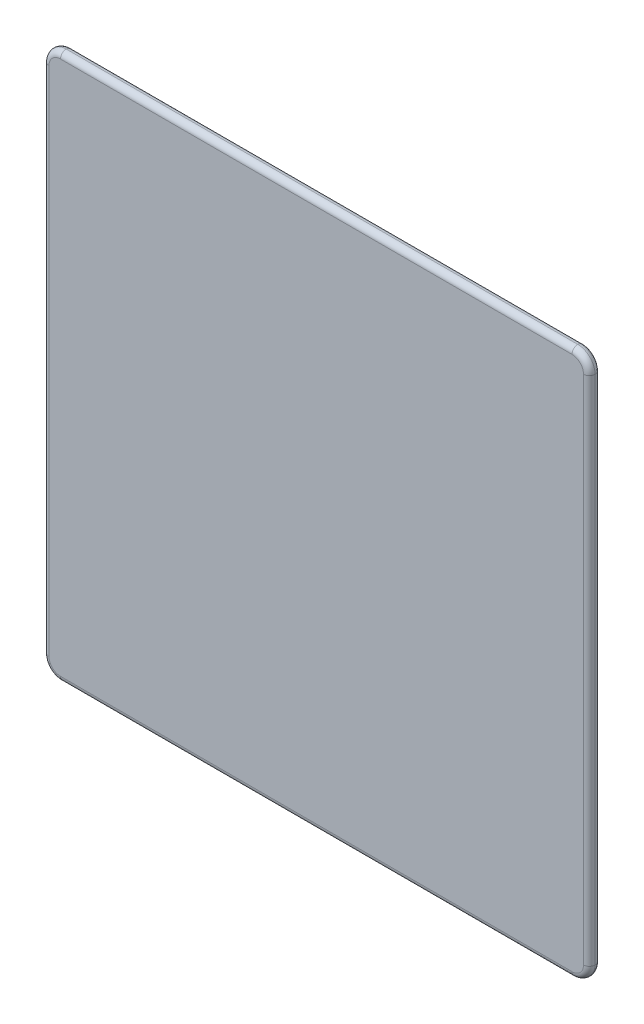
ISO-10303-21;
HEADER;
FILE_DESCRIPTION(('STEP AP214'),'2;1');
FILE_NAME('part.step','',(''),(''),'','','');
FILE_SCHEMA(('AUTOMOTIVE_DESIGN { 1 0 10303 214 1 1 1 1 }'));
ENDSEC;
DATA;
#1=APPLICATION_CONTEXT('core data for automotive mechanical design processes');
#2=APPLICATION_PROTOCOL_DEFINITION('international standard','automotive_design',2000,#1);
#3=PRODUCT_CONTEXT('',#1,'mechanical');
#4=PRODUCT('Part','Part','',(#3));
#5=PRODUCT_RELATED_PRODUCT_CATEGORY('part','',(#4));
#6=PRODUCT_DEFINITION_FORMATION('','',#4);
#7=PRODUCT_DEFINITION_CONTEXT('part definition',#1,'design');
#8=PRODUCT_DEFINITION('design','',#6,#7);
#9=PRODUCT_DEFINITION_SHAPE('','',#8);
#10=(LENGTH_UNIT() NAMED_UNIT(*) SI_UNIT(.MILLI.,.METRE.));
#11=(NAMED_UNIT(*) PLANE_ANGLE_UNIT() SI_UNIT($,.RADIAN.));
#12=(NAMED_UNIT(*) SI_UNIT($,.STERADIAN.) SOLID_ANGLE_UNIT());
#13=UNCERTAINTY_MEASURE_WITH_UNIT(LENGTH_MEASURE(1.E-05),#10,'distance_accuracy_value','');
#14=(GEOMETRIC_REPRESENTATION_CONTEXT(3) GLOBAL_UNCERTAINTY_ASSIGNED_CONTEXT((#13)) GLOBAL_UNIT_ASSIGNED_CONTEXT((#10,
#11,#12)) REPRESENTATION_CONTEXT('',''));
#15=CARTESIAN_POINT('',(0.,0.,0.));
#16=DIRECTION('',(0.,0.,1.));
#17=DIRECTION('',(1.,0.,0.));
#18=AXIS2_PLACEMENT_3D('',#15,#16,#17);
#19=CARTESIAN_POINT('',(0.,0.,2.));
#20=DIRECTION('',(0.,0.,1.));
#21=DIRECTION('',(1.,0.,0.));
#22=AXIS2_PLACEMENT_3D('',#19,#20,#21);
#23=PLANE('',#22);
#24=DIRECTION('',(0.,1.,0.));
#25=VECTOR('',#24,1.);
#26=CARTESIAN_POINT('',(46.4,44.4,2.));
#27=LINE('',#26,#25);
#28=CARTESIAN_POINT('',(46.4,-44.4,2.));
#29=VERTEX_POINT('',#28);
#30=CARTESIAN_POINT('',(46.4,44.4,2.));
#31=VERTEX_POINT('',#30);
#32=EDGE_CURVE('E49',#29,#31,#27,.T.);
#33=ORIENTED_EDGE('',*,*,#32,.T.);
#34=CARTESIAN_POINT('',(44.4,44.4,2.));
#35=DIRECTION('',(0.,0.,1.));
#36=DIRECTION('',(1.,0.,0.));
#37=AXIS2_PLACEMENT_3D('',#34,#35,#36);
#38=CIRCLE('',#37,2.);
#39=CARTESIAN_POINT('',(44.4,46.4,2.));
#40=VERTEX_POINT('',#39);
#41=EDGE_CURVE('E11',#31,#40,#38,.T.);
#42=ORIENTED_EDGE('',*,*,#41,.T.);
#43=DIRECTION('',(-1.,0.,0.));
#44=VECTOR('',#43,1.);
#45=CARTESIAN_POINT('',(-44.4,46.4,2.));
#46=LINE('',#45,#44);
#47=CARTESIAN_POINT('',(-44.4,46.4,2.));
#48=VERTEX_POINT('',#47);
#49=EDGE_CURVE('E240',#40,#48,#46,.T.);
#50=ORIENTED_EDGE('',*,*,#49,.T.);
#51=CARTESIAN_POINT('',(-44.4,44.4,2.));
#52=DIRECTION('',(0.,0.,1.));
#53=DIRECTION('',(1.,0.,0.));
#54=AXIS2_PLACEMENT_3D('',#51,#52,#53);
#55=CIRCLE('',#54,2.);
#56=CARTESIAN_POINT('',(-46.4,44.4,2.));
#57=VERTEX_POINT('',#56);
#58=EDGE_CURVE('E237',#48,#57,#55,.T.);
#59=ORIENTED_EDGE('',*,*,#58,.T.);
#60=DIRECTION('',(0.,-1.,0.));
#61=VECTOR('',#60,1.);
#62=CARTESIAN_POINT('',(-46.4,-44.4,2.));
#63=LINE('',#62,#61);
#64=CARTESIAN_POINT('',(-46.4,-44.4,2.));
#65=VERTEX_POINT('',#64);
#66=EDGE_CURVE('E241',#57,#65,#63,.T.);
#67=ORIENTED_EDGE('',*,*,#66,.T.);
#68=CARTESIAN_POINT('',(-44.4,-44.4,2.));
#69=DIRECTION('',(0.,0.,1.));
#70=DIRECTION('',(1.,0.,0.));
#71=AXIS2_PLACEMENT_3D('',#68,#69,#70);
#72=CIRCLE('',#71,2.);
#73=CARTESIAN_POINT('',(-44.4,-46.4,2.));
#74=VERTEX_POINT('',#73);
#75=EDGE_CURVE('E139',#65,#74,#72,.T.);
#76=ORIENTED_EDGE('',*,*,#75,.T.);
#77=DIRECTION('',(1.,0.,0.));
#78=VECTOR('',#77,1.);
#79=CARTESIAN_POINT('',(44.4,-46.4,2.));
#80=LINE('',#79,#78);
#81=CARTESIAN_POINT('',(44.4,-46.4,2.));
#82=VERTEX_POINT('',#81);
#83=EDGE_CURVE('E133',#74,#82,#80,.T.);
#84=ORIENTED_EDGE('',*,*,#83,.T.);
#85=CARTESIAN_POINT('',(44.4,-44.4,2.));
#86=DIRECTION('',(0.,0.,1.));
#87=DIRECTION('',(1.,0.,0.));
#88=AXIS2_PLACEMENT_3D('',#85,#86,#87);
#89=CIRCLE('',#88,2.);
#90=EDGE_CURVE('E136',#82,#29,#89,.T.);
#91=ORIENTED_EDGE('',*,*,#90,.T.);
#92=EDGE_LOOP('',(#33,#42,#50,#59,#67,#76,#84,#91));
#93=FACE_BOUND('',#92,.T.);
#94=ADVANCED_FACE('F37',(#93),#23,.T.);
#95=CARTESIAN_POINT('',(0.,0.,0.));
#96=DIRECTION('',(0.,0.,1.));
#97=DIRECTION('',(1.,0.,0.));
#98=AXIS2_PLACEMENT_3D('',#95,#96,#97);
#99=PLANE('',#98);
#100=DIRECTION('',(-1.,0.,0.));
#101=VECTOR('',#100,1.);
#102=CARTESIAN_POINT('',(0.,46.4,0.));
#103=LINE('',#102,#101);
#104=CARTESIAN_POINT('',(-44.4,46.4,0.));
#105=VERTEX_POINT('',#104);
#106=CARTESIAN_POINT('',(44.4,46.4,0.));
#107=VERTEX_POINT('',#106);
#108=EDGE_CURVE('E217',#105,#107,#103,.F.);
#109=ORIENTED_EDGE('',*,*,#108,.T.);
#110=CARTESIAN_POINT('',(44.4,44.4,0.));
#111=DIRECTION('',(0.,0.,1.));
#112=DIRECTION('',(1.,0.,0.));
#113=AXIS2_PLACEMENT_3D('',#110,#111,#112);
#114=CIRCLE('',#113,2.);
#115=CARTESIAN_POINT('',(46.4,44.4,0.));
#116=VERTEX_POINT('',#115);
#117=EDGE_CURVE('E232',#107,#116,#114,.F.);
#118=ORIENTED_EDGE('',*,*,#117,.T.);
#119=DIRECTION('',(0.,1.,0.));
#120=VECTOR('',#119,1.);
#121=CARTESIAN_POINT('',(46.4,0.,0.));
#122=LINE('',#121,#120);
#123=CARTESIAN_POINT('',(46.4,-44.4,0.));
#124=VERTEX_POINT('',#123);
#125=EDGE_CURVE('E231',#116,#124,#122,.F.);
#126=ORIENTED_EDGE('',*,*,#125,.T.);
#127=CARTESIAN_POINT('',(44.4,-44.4,0.));
#128=DIRECTION('',(0.,0.,1.));
#129=DIRECTION('',(1.,0.,0.));
#130=AXIS2_PLACEMENT_3D('',#127,#128,#129);
#131=CIRCLE('',#130,2.);
#132=CARTESIAN_POINT('',(44.4,-46.4,0.));
#133=VERTEX_POINT('',#132);
#134=EDGE_CURVE('E233',#124,#133,#131,.F.);
#135=ORIENTED_EDGE('',*,*,#134,.T.);
#136=DIRECTION('',(1.,0.,0.));
#137=VECTOR('',#136,1.);
#138=CARTESIAN_POINT('',(0.,-46.4,0.));
#139=LINE('',#138,#137);
#140=CARTESIAN_POINT('',(-44.4,-46.4,0.));
#141=VERTEX_POINT('',#140);
#142=EDGE_CURVE('E230',#133,#141,#139,.F.);
#143=ORIENTED_EDGE('',*,*,#142,.T.);
#144=CARTESIAN_POINT('',(-44.4,-44.4,0.));
#145=DIRECTION('',(0.,0.,1.));
#146=DIRECTION('',(1.,0.,0.));
#147=AXIS2_PLACEMENT_3D('',#144,#145,#146);
#148=CIRCLE('',#147,2.);
#149=CARTESIAN_POINT('',(-46.4,-44.4,0.));
#150=VERTEX_POINT('',#149);
#151=EDGE_CURVE('E227',#141,#150,#148,.F.);
#152=ORIENTED_EDGE('',*,*,#151,.T.);
#153=DIRECTION('',(0.,-1.,0.));
#154=VECTOR('',#153,1.);
#155=CARTESIAN_POINT('',(-46.4,0.,0.));
#156=LINE('',#155,#154);
#157=CARTESIAN_POINT('',(-46.4,44.4,0.));
#158=VERTEX_POINT('',#157);
#159=EDGE_CURVE('E221',#150,#158,#156,.F.);
#160=ORIENTED_EDGE('',*,*,#159,.T.);
#161=CARTESIAN_POINT('',(-44.4,44.4,0.));
#162=DIRECTION('',(0.,0.,1.));
#163=DIRECTION('',(1.,0.,0.));
#164=AXIS2_PLACEMENT_3D('',#161,#162,#163);
#165=CIRCLE('',#164,2.);
#166=EDGE_CURVE('E96',#158,#105,#165,.F.);
#167=ORIENTED_EDGE('',*,*,#166,.T.);
#168=EDGE_LOOP('',(#109,#118,#126,#135,#143,#152,#160,#167));
#169=FACE_BOUND('',#168,.T.);
#170=ADVANCED_FACE('F282',(#169),#99,.F.);
#171=CARTESIAN_POINT('',(-44.4,-44.4,1.));
#172=DIRECTION('',(0.,0.,1.));
#173=DIRECTION('',(1.,0.,0.));
#174=AXIS2_PLACEMENT_3D('',#171,#172,#173);
#175=TOROIDAL_SURFACE('',#174,2.,1.);
#176=CARTESIAN_POINT('',(-44.4,-46.4,1.));
#177=DIRECTION('',(1.,0.,0.));
#178=DIRECTION('',(0.,0.,-1.));
#179=AXIS2_PLACEMENT_3D('',#176,#177,#178);
#180=CIRCLE('',#179,1.);
#181=CARTESIAN_POINT('',(-44.4,-47.4,1.));
#182=VERTEX_POINT('',#181);
#183=EDGE_CURVE('E212',#74,#182,#180,.T.);
#184=ORIENTED_EDGE('',*,*,#183,.F.);
#185=ORIENTED_EDGE('',*,*,#75,.F.);
#186=CARTESIAN_POINT('',(-46.4,-44.4,1.));
#187=DIRECTION('',(0.,1.,0.));
#188=DIRECTION('',(0.,0.,1.));
#189=AXIS2_PLACEMENT_3D('',#186,#187,#188);
#190=CIRCLE('',#189,1.);
#191=CARTESIAN_POINT('',(-47.4,-44.4,1.));
#192=VERTEX_POINT('',#191);
#193=EDGE_CURVE('E42',#192,#65,#190,.T.);
#194=ORIENTED_EDGE('',*,*,#193,.F.);
#195=CARTESIAN_POINT('',(-44.4,-44.4,1.));
#196=DIRECTION('',(0.,0.,1.));
#197=DIRECTION('',(1.,0.,0.));
#198=AXIS2_PLACEMENT_3D('',#195,#196,#197);
#199=CIRCLE('',#198,3.);
#200=EDGE_CURVE('E87',#182,#192,#199,.F.);
#201=ORIENTED_EDGE('',*,*,#200,.F.);
#202=EDGE_LOOP('',(#184,#185,#194,#201));
#203=FACE_BOUND('',#202,.T.);
#204=ADVANCED_FACE('F45',(#203),#175,.T.);
#205=CARTESIAN_POINT('',(-46.4,0.,1.));
#206=DIRECTION('',(0.,1.,0.));
#207=DIRECTION('',(-1.,0.,0.));
#208=AXIS2_PLACEMENT_3D('',#205,#206,#207);
#209=CYLINDRICAL_SURFACE('',#208,1.);
#210=ORIENTED_EDGE('',*,*,#193,.T.);
#211=ORIENTED_EDGE('',*,*,#66,.F.);
#212=CARTESIAN_POINT('',(-46.4,44.4,1.));
#213=DIRECTION('',(0.,1.,0.));
#214=DIRECTION('',(0.,0.,1.));
#215=AXIS2_PLACEMENT_3D('',#212,#213,#214);
#216=CIRCLE('',#215,1.);
#217=CARTESIAN_POINT('',(-47.4,44.4,1.));
#218=VERTEX_POINT('',#217);
#219=EDGE_CURVE('E206',#218,#57,#216,.T.);
#220=ORIENTED_EDGE('',*,*,#219,.F.);
#221=DIRECTION('',(0.,-1.,0.));
#222=VECTOR('',#221,1.);
#223=CARTESIAN_POINT('',(-47.4,44.4,1.));
#224=LINE('',#223,#222);
#225=EDGE_CURVE('E204',#192,#218,#224,.F.);
#226=ORIENTED_EDGE('',*,*,#225,.F.);
#227=EDGE_LOOP('',(#210,#211,#220,#226));
#228=FACE_BOUND('',#227,.T.);
#229=ADVANCED_FACE('F274',(#228),#209,.T.);
#230=CARTESIAN_POINT('',(-44.4,-44.4,1.));
#231=DIRECTION('',(0.,0.,1.));
#232=DIRECTION('',(1.,0.,0.));
#233=AXIS2_PLACEMENT_3D('',#230,#231,#232);
#234=TOROIDAL_SURFACE('',#233,2.,1.);
#235=CARTESIAN_POINT('',(-44.4,-46.4,1.));
#236=DIRECTION('',(1.,0.,0.));
#237=DIRECTION('',(0.,0.,-1.));
#238=AXIS2_PLACEMENT_3D('',#235,#236,#237);
#239=CIRCLE('',#238,1.);
#240=EDGE_CURVE('E196',#182,#141,#239,.T.);
#241=ORIENTED_EDGE('',*,*,#240,.F.);
#242=ORIENTED_EDGE('',*,*,#200,.T.);
#243=CARTESIAN_POINT('',(-46.4,-44.4,1.));
#244=DIRECTION('',(0.,1.,0.));
#245=DIRECTION('',(0.,0.,1.));
#246=AXIS2_PLACEMENT_3D('',#243,#244,#245);
#247=CIRCLE('',#246,1.);
#248=EDGE_CURVE('E205',#150,#192,#247,.T.);
#249=ORIENTED_EDGE('',*,*,#248,.F.);
#250=ORIENTED_EDGE('',*,*,#151,.F.);
#251=EDGE_LOOP('',(#241,#242,#249,#250));
#252=FACE_BOUND('',#251,.T.);
#253=ADVANCED_FACE('F242',(#252),#234,.T.);
#254=CARTESIAN_POINT('',(0.,-46.4,1.));
#255=DIRECTION('',(-1.,0.,0.));
#256=DIRECTION('',(0.,0.,1.));
#257=AXIS2_PLACEMENT_3D('',#254,#255,#256);
#258=CYLINDRICAL_SURFACE('',#257,1.);
#259=ORIENTED_EDGE('',*,*,#83,.F.);
#260=ORIENTED_EDGE('',*,*,#183,.T.);
#261=DIRECTION('',(1.,0.,0.));
#262=VECTOR('',#261,1.);
#263=CARTESIAN_POINT('',(-44.4,-47.4,1.));
#264=LINE('',#263,#262);
#265=CARTESIAN_POINT('',(44.4,-47.4,1.));
#266=VERTEX_POINT('',#265);
#267=EDGE_CURVE('E150',#266,#182,#264,.F.);
#268=ORIENTED_EDGE('',*,*,#267,.F.);
#269=CARTESIAN_POINT('',(44.4,-46.4,1.));
#270=DIRECTION('',(1.,0.,0.));
#271=DIRECTION('',(0.,0.,-1.));
#272=AXIS2_PLACEMENT_3D('',#269,#270,#271);
#273=CIRCLE('',#272,1.);
#274=EDGE_CURVE('E144',#82,#266,#273,.T.);
#275=ORIENTED_EDGE('',*,*,#274,.F.);
#276=EDGE_LOOP('',(#259,#260,#268,#275));
#277=FACE_BOUND('',#276,.T.);
#278=ADVANCED_FACE('F143',(#277),#258,.T.);
#279=CARTESIAN_POINT('',(-44.4,44.4,1.));
#280=DIRECTION('',(0.,0.,1.));
#281=DIRECTION('',(1.,0.,0.));
#282=AXIS2_PLACEMENT_3D('',#279,#280,#281);
#283=TOROIDAL_SURFACE('',#282,2.,1.);
#284=ORIENTED_EDGE('',*,*,#219,.T.);
#285=ORIENTED_EDGE('',*,*,#58,.F.);
#286=CARTESIAN_POINT('',(-44.4,46.4,1.));
#287=DIRECTION('',(1.,0.,0.));
#288=DIRECTION('',(0.,0.,-1.));
#289=AXIS2_PLACEMENT_3D('',#286,#287,#288);
#290=CIRCLE('',#289,1.);
#291=CARTESIAN_POINT('',(-44.4,47.4,1.));
#292=VERTEX_POINT('',#291);
#293=EDGE_CURVE('E148',#292,#48,#290,.T.);
#294=ORIENTED_EDGE('',*,*,#293,.F.);
#295=CARTESIAN_POINT('',(-44.4,44.4,1.));
#296=DIRECTION('',(0.,0.,1.));
#297=DIRECTION('',(1.,0.,0.));
#298=AXIS2_PLACEMENT_3D('',#295,#296,#297);
#299=CIRCLE('',#298,3.);
#300=EDGE_CURVE('E194',#218,#292,#299,.F.);
#301=ORIENTED_EDGE('',*,*,#300,.F.);
#302=EDGE_LOOP('',(#284,#285,#294,#301));
#303=FACE_BOUND('',#302,.T.);
#304=ADVANCED_FACE('F265',(#303),#283,.T.);
#305=CARTESIAN_POINT('',(-46.4,47.4,1.));
#306=DIRECTION('',(0.,-1.,0.));
#307=DIRECTION('',(1.,0.,0.));
#308=AXIS2_PLACEMENT_3D('',#305,#306,#307);
#309=CYLINDRICAL_SURFACE('',#308,1.);
#310=ORIENTED_EDGE('',*,*,#248,.T.);
#311=ORIENTED_EDGE('',*,*,#225,.T.);
#312=CARTESIAN_POINT('',(-46.4,44.4,1.));
#313=DIRECTION('',(0.,1.,0.));
#314=DIRECTION('',(0.,0.,1.));
#315=AXIS2_PLACEMENT_3D('',#312,#313,#314);
#316=CIRCLE('',#315,1.);
#317=EDGE_CURVE('E188',#158,#218,#316,.T.);
#318=ORIENTED_EDGE('',*,*,#317,.F.);
#319=ORIENTED_EDGE('',*,*,#159,.F.);
#320=EDGE_LOOP('',(#310,#311,#318,#319));
#321=FACE_BOUND('',#320,.T.);
#322=ADVANCED_FACE('F271',(#321),#309,.T.);
#323=CARTESIAN_POINT('',(47.4,-46.4,1.));
#324=DIRECTION('',(1.,0.,0.));
#325=DIRECTION('',(0.,0.,-1.));
#326=AXIS2_PLACEMENT_3D('',#323,#324,#325);
#327=CYLINDRICAL_SURFACE('',#326,1.);
#328=ORIENTED_EDGE('',*,*,#240,.T.);
#329=ORIENTED_EDGE('',*,*,#142,.F.);
#330=CARTESIAN_POINT('',(44.4,-46.4,1.));
#331=DIRECTION('',(1.,0.,0.));
#332=DIRECTION('',(0.,0.,-1.));
#333=AXIS2_PLACEMENT_3D('',#330,#331,#332);
#334=CIRCLE('',#333,1.);
#335=EDGE_CURVE('E190',#266,#133,#334,.T.);
#336=ORIENTED_EDGE('',*,*,#335,.F.);
#337=ORIENTED_EDGE('',*,*,#267,.T.);
#338=EDGE_LOOP('',(#328,#329,#336,#337));
#339=FACE_BOUND('',#338,.T.);
#340=ADVANCED_FACE('F250',(#339),#327,.T.);
#341=CARTESIAN_POINT('',(44.4,-44.4,1.));
#342=DIRECTION('',(0.,0.,1.));
#343=DIRECTION('',(1.,0.,0.));
#344=AXIS2_PLACEMENT_3D('',#341,#342,#343);
#345=TOROIDAL_SURFACE('',#344,2.,1.);
#346=ORIENTED_EDGE('',*,*,#90,.F.);
#347=ORIENTED_EDGE('',*,*,#274,.T.);
#348=CARTESIAN_POINT('',(44.4,-44.4,1.));
#349=DIRECTION('',(0.,0.,1.));
#350=DIRECTION('',(1.,0.,0.));
#351=AXIS2_PLACEMENT_3D('',#348,#349,#350);
#352=CIRCLE('',#351,3.);
#353=CARTESIAN_POINT('',(47.4,-44.4,1.));
#354=VERTEX_POINT('',#353);
#355=EDGE_CURVE('E183',#354,#266,#352,.F.);
#356=ORIENTED_EDGE('',*,*,#355,.F.);
#357=CARTESIAN_POINT('',(46.4,-44.4,1.));
#358=DIRECTION('',(0.,1.,0.));
#359=DIRECTION('',(0.,0.,1.));
#360=AXIS2_PLACEMENT_3D('',#357,#358,#359);
#361=CIRCLE('',#360,1.);
#362=EDGE_CURVE('E151',#29,#354,#361,.T.);
#363=ORIENTED_EDGE('',*,*,#362,.F.);
#364=EDGE_LOOP('',(#346,#347,#356,#363));
#365=FACE_BOUND('',#364,.T.);
#366=ADVANCED_FACE('F155',(#365),#345,.T.);
#367=CARTESIAN_POINT('',(0.,46.4,1.));
#368=DIRECTION('',(1.,0.,0.));
#369=DIRECTION('',(0.,0.,-1.));
#370=AXIS2_PLACEMENT_3D('',#367,#368,#369);
#371=CYLINDRICAL_SURFACE('',#370,1.);
#372=ORIENTED_EDGE('',*,*,#293,.T.);
#373=ORIENTED_EDGE('',*,*,#49,.F.);
#374=CARTESIAN_POINT('',(44.4,46.4,1.));
#375=DIRECTION('',(1.,0.,0.));
#376=DIRECTION('',(0.,0.,-1.));
#377=AXIS2_PLACEMENT_3D('',#374,#375,#376);
#378=CIRCLE('',#377,1.);
#379=CARTESIAN_POINT('',(44.4,47.4,1.));
#380=VERTEX_POINT('',#379);
#381=EDGE_CURVE('E177',#380,#40,#378,.T.);
#382=ORIENTED_EDGE('',*,*,#381,.F.);
#383=DIRECTION('',(-1.,0.,0.));
#384=VECTOR('',#383,1.);
#385=CARTESIAN_POINT('',(44.4,47.4,1.));
#386=LINE('',#385,#384);
#387=EDGE_CURVE('E176',#292,#380,#386,.F.);
#388=ORIENTED_EDGE('',*,*,#387,.F.);
#389=EDGE_LOOP('',(#372,#373,#382,#388));
#390=FACE_BOUND('',#389,.T.);
#391=ADVANCED_FACE('F263',(#390),#371,.T.);
#392=CARTESIAN_POINT('',(-44.4,44.4,1.));
#393=DIRECTION('',(0.,0.,1.));
#394=DIRECTION('',(1.,0.,0.));
#395=AXIS2_PLACEMENT_3D('',#392,#393,#394);
#396=TOROIDAL_SURFACE('',#395,2.,1.);
#397=ORIENTED_EDGE('',*,*,#317,.T.);
#398=ORIENTED_EDGE('',*,*,#300,.T.);
#399=CARTESIAN_POINT('',(-44.4,46.4,1.));
#400=DIRECTION('',(1.,0.,0.));
#401=DIRECTION('',(0.,0.,-1.));
#402=AXIS2_PLACEMENT_3D('',#399,#400,#401);
#403=CIRCLE('',#402,1.);
#404=EDGE_CURVE('E173',#105,#292,#403,.T.);
#405=ORIENTED_EDGE('',*,*,#404,.F.);
#406=ORIENTED_EDGE('',*,*,#166,.F.);
#407=EDGE_LOOP('',(#397,#398,#405,#406));
#408=FACE_BOUND('',#407,.T.);
#409=ADVANCED_FACE('F267',(#408),#396,.T.);
#410=CARTESIAN_POINT('',(44.4,-44.4,1.));
#411=DIRECTION('',(0.,0.,1.));
#412=DIRECTION('',(1.,0.,0.));
#413=AXIS2_PLACEMENT_3D('',#410,#411,#412);
#414=TOROIDAL_SURFACE('',#413,2.,1.);
#415=ORIENTED_EDGE('',*,*,#335,.T.);
#416=ORIENTED_EDGE('',*,*,#134,.F.);
#417=CARTESIAN_POINT('',(46.4,-44.4,1.));
#418=DIRECTION('',(0.,1.,0.));
#419=DIRECTION('',(0.,0.,1.));
#420=AXIS2_PLACEMENT_3D('',#417,#418,#419);
#421=CIRCLE('',#420,1.);
#422=EDGE_CURVE('E167',#354,#124,#421,.T.);
#423=ORIENTED_EDGE('',*,*,#422,.F.);
#424=ORIENTED_EDGE('',*,*,#355,.T.);
#425=EDGE_LOOP('',(#415,#416,#423,#424));
#426=FACE_BOUND('',#425,.T.);
#427=ADVANCED_FACE('F252',(#426),#414,.T.);
#428=CARTESIAN_POINT('',(46.4,0.,1.));
#429=DIRECTION('',(0.,-1.,0.));
#430=DIRECTION('',(1.,0.,0.));
#431=AXIS2_PLACEMENT_3D('',#428,#429,#430);
#432=CYLINDRICAL_SURFACE('',#431,1.);
#433=CARTESIAN_POINT('',(46.4,44.4,1.));
#434=DIRECTION('',(0.,1.,0.));
#435=DIRECTION('',(0.,0.,1.));
#436=AXIS2_PLACEMENT_3D('',#433,#434,#435);
#437=CIRCLE('',#436,1.);
#438=CARTESIAN_POINT('',(47.4,44.4,1.));
#439=VERTEX_POINT('',#438);
#440=EDGE_CURVE('E181',#31,#439,#437,.T.);
#441=ORIENTED_EDGE('',*,*,#440,.F.);
#442=ORIENTED_EDGE('',*,*,#32,.F.);
#443=ORIENTED_EDGE('',*,*,#362,.T.);
#444=DIRECTION('',(0.,1.,0.));
#445=VECTOR('',#444,1.);
#446=CARTESIAN_POINT('',(47.4,-44.4,1.));
#447=LINE('',#446,#445);
#448=EDGE_CURVE('E170',#439,#354,#447,.F.);
#449=ORIENTED_EDGE('',*,*,#448,.F.);
#450=EDGE_LOOP('',(#441,#442,#443,#449));
#451=FACE_BOUND('',#450,.T.);
#452=ADVANCED_FACE('F251',(#451),#432,.T.);
#453=CARTESIAN_POINT('',(44.4,44.4,1.));
#454=DIRECTION('',(0.,0.,1.));
#455=DIRECTION('',(1.,0.,0.));
#456=AXIS2_PLACEMENT_3D('',#453,#454,#455);
#457=TOROIDAL_SURFACE('',#456,2.,1.);
#458=ORIENTED_EDGE('',*,*,#41,.F.);
#459=ORIENTED_EDGE('',*,*,#440,.T.);
#460=CARTESIAN_POINT('',(44.4,44.4,1.));
#461=DIRECTION('',(0.,0.,1.));
#462=DIRECTION('',(1.,0.,0.));
#463=AXIS2_PLACEMENT_3D('',#460,#461,#462);
#464=CIRCLE('',#463,3.);
#465=EDGE_CURVE('E165',#380,#439,#464,.F.);
#466=ORIENTED_EDGE('',*,*,#465,.F.);
#467=ORIENTED_EDGE('',*,*,#381,.T.);
#468=EDGE_LOOP('',(#458,#459,#466,#467));
#469=FACE_BOUND('',#468,.T.);
#470=ADVANCED_FACE('F259',(#469),#457,.T.);
#471=CARTESIAN_POINT('',(47.4,46.4,1.));
#472=DIRECTION('',(-1.,0.,0.));
#473=DIRECTION('',(0.,0.,1.));
#474=AXIS2_PLACEMENT_3D('',#471,#472,#473);
#475=CYLINDRICAL_SURFACE('',#474,1.);
#476=ORIENTED_EDGE('',*,*,#404,.T.);
#477=ORIENTED_EDGE('',*,*,#387,.T.);
#478=CARTESIAN_POINT('',(44.4,46.4,1.));
#479=DIRECTION('',(1.,0.,0.));
#480=DIRECTION('',(0.,0.,-1.));
#481=AXIS2_PLACEMENT_3D('',#478,#479,#480);
#482=CIRCLE('',#481,1.);
#483=EDGE_CURVE('E163',#107,#380,#482,.T.);
#484=ORIENTED_EDGE('',*,*,#483,.F.);
#485=ORIENTED_EDGE('',*,*,#108,.F.);
#486=EDGE_LOOP('',(#476,#477,#484,#485));
#487=FACE_BOUND('',#486,.T.);
#488=ADVANCED_FACE('F270',(#487),#475,.T.);
#489=CARTESIAN_POINT('',(46.4,47.4,1.));
#490=DIRECTION('',(0.,1.,0.));
#491=DIRECTION('',(-1.,0.,0.));
#492=AXIS2_PLACEMENT_3D('',#489,#490,#491);
#493=CYLINDRICAL_SURFACE('',#492,1.);
#494=ORIENTED_EDGE('',*,*,#422,.T.);
#495=ORIENTED_EDGE('',*,*,#125,.F.);
#496=CARTESIAN_POINT('',(46.4,44.4,1.));
#497=DIRECTION('',(0.,1.,0.));
#498=DIRECTION('',(0.,0.,1.));
#499=AXIS2_PLACEMENT_3D('',#496,#497,#498);
#500=CIRCLE('',#499,1.);
#501=EDGE_CURVE('E157',#439,#116,#500,.T.);
#502=ORIENTED_EDGE('',*,*,#501,.F.);
#503=ORIENTED_EDGE('',*,*,#448,.T.);
#504=EDGE_LOOP('',(#494,#495,#502,#503));
#505=FACE_BOUND('',#504,.T.);
#506=ADVANCED_FACE('F292',(#505),#493,.T.);
#507=CARTESIAN_POINT('',(44.4,44.4,1.));
#508=DIRECTION('',(0.,0.,1.));
#509=DIRECTION('',(1.,0.,0.));
#510=AXIS2_PLACEMENT_3D('',#507,#508,#509);
#511=TOROIDAL_SURFACE('',#510,2.,1.);
#512=ORIENTED_EDGE('',*,*,#483,.T.);
#513=ORIENTED_EDGE('',*,*,#465,.T.);
#514=ORIENTED_EDGE('',*,*,#501,.T.);
#515=ORIENTED_EDGE('',*,*,#117,.F.);
#516=EDGE_LOOP('',(#512,#513,#514,#515));
#517=FACE_BOUND('',#516,.T.);
#518=ADVANCED_FACE('F287',(#517),#511,.T.);
#519=CLOSED_SHELL('',(#94,#170,#204,#229,#253,#278,#304,#322,#340,#366,#391,#409,#427,#452,#470,
#488,#506,#518));
#520=MANIFOLD_SOLID_BREP('B2',#519);
#521=ADVANCED_BREP_SHAPE_REPRESENTATION('',(#18,#520),#14);
#522=SHAPE_DEFINITION_REPRESENTATION(#9,#521);
ENDSEC;
END-ISO-10303-21;
